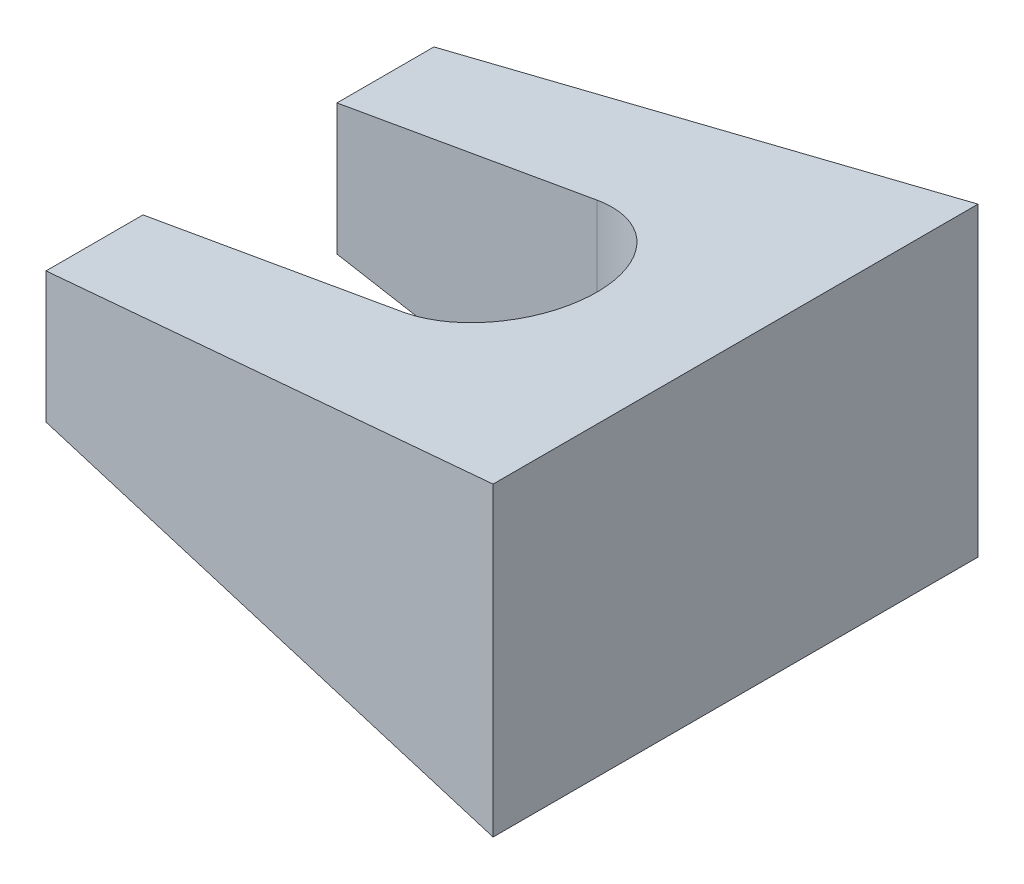
ISO-10303-21;
HEADER;
FILE_DESCRIPTION(('STEP AP214'),'2;1');
FILE_NAME('part.step','',(''),(''),'','','');
FILE_SCHEMA(('AUTOMOTIVE_DESIGN { 1 0 10303 214 1 1 1 1 }'));
ENDSEC;
DATA;
#1=APPLICATION_CONTEXT('core data for automotive mechanical design processes');
#2=APPLICATION_PROTOCOL_DEFINITION('international standard','automotive_design',2000,#1);
#3=PRODUCT_CONTEXT('',#1,'mechanical');
#4=PRODUCT('Part','Part','',(#3));
#5=PRODUCT_RELATED_PRODUCT_CATEGORY('part','',(#4));
#6=PRODUCT_DEFINITION_FORMATION('','',#4);
#7=PRODUCT_DEFINITION_CONTEXT('part definition',#1,'design');
#8=PRODUCT_DEFINITION('design','',#6,#7);
#9=PRODUCT_DEFINITION_SHAPE('','',#8);
#10=(LENGTH_UNIT() NAMED_UNIT(*) SI_UNIT(.MILLI.,.METRE.));
#11=(NAMED_UNIT(*) PLANE_ANGLE_UNIT() SI_UNIT($,.RADIAN.));
#12=(NAMED_UNIT(*) SI_UNIT($,.STERADIAN.) SOLID_ANGLE_UNIT());
#13=UNCERTAINTY_MEASURE_WITH_UNIT(LENGTH_MEASURE(1.E-05),#10,'distance_accuracy_value','');
#14=(GEOMETRIC_REPRESENTATION_CONTEXT(3) GLOBAL_UNCERTAINTY_ASSIGNED_CONTEXT((#13)) GLOBAL_UNIT_ASSIGNED_CONTEXT((#10,
#11,#12)) REPRESENTATION_CONTEXT('',''));
#15=CARTESIAN_POINT('',(0.,0.,0.));
#16=DIRECTION('',(0.,0.,1.));
#17=DIRECTION('',(1.,0.,0.));
#18=AXIS2_PLACEMENT_3D('',#15,#16,#17);
#19=CARTESIAN_POINT('',(-12.7739862611481,25.,10.));
#20=DIRECTION('',(1.,0.,0.));
#21=DIRECTION('',(0.,0.,-1.));
#22=AXIS2_PLACEMENT_3D('',#19,#20,#21);
#23=PLANE('',#22);
#24=DIRECTION('',(0.,0.,1.));
#25=VECTOR('',#24,1.);
#26=CARTESIAN_POINT('',(-12.7739862611481,-3.37531742098281,-12.5));
#27=LINE('',#26,#25);
#28=CARTESIAN_POINT('',(-12.7739862611481,-3.37531742098281,-10.));
#29=VERTEX_POINT('',#28);
#30=CARTESIAN_POINT('',(-12.7739862611481,-3.37531742098281,-5.));
#31=VERTEX_POINT('',#30);
#32=EDGE_CURVE('E132',#29,#31,#27,.T.);
#33=ORIENTED_EDGE('',*,*,#32,.T.);
#34=DIRECTION('',(0.,1.,0.));
#35=VECTOR('',#34,1.);
#36=CARTESIAN_POINT('',(-12.7739862611481,25.,-5.));
#37=LINE('',#36,#35);
#38=CARTESIAN_POINT('',(-12.7739862611481,3.37531742098281,-5.));
#39=VERTEX_POINT('',#38);
#40=EDGE_CURVE('E109',#31,#39,#37,.T.);
#41=ORIENTED_EDGE('',*,*,#40,.T.);
#42=DIRECTION('',(0.,0.,1.));
#43=VECTOR('',#42,1.);
#44=CARTESIAN_POINT('',(-12.7739862611481,3.37531742098281,-12.5));
#45=LINE('',#44,#43);
#46=CARTESIAN_POINT('',(-12.7739862611481,3.37531742098281,-10.));
#47=VERTEX_POINT('',#46);
#48=EDGE_CURVE('E135',#47,#39,#45,.T.);
#49=ORIENTED_EDGE('',*,*,#48,.F.);
#50=DIRECTION('',(0.,-1.,0.));
#51=VECTOR('',#50,1.);
#52=CARTESIAN_POINT('',(-12.7739862611481,25.,-10.));
#53=LINE('',#52,#51);
#54=EDGE_CURVE('E153',#47,#29,#53,.T.);
#55=ORIENTED_EDGE('',*,*,#54,.T.);
#56=EDGE_LOOP('',(#33,#41,#49,#55));
#57=FACE_BOUND('',#56,.T.);
#58=ADVANCED_FACE('F34',(#57),#23,.F.);
#59=CARTESIAN_POINT('',(-12.7739862611481,25.,-10.));
#60=DIRECTION('',(0.0973899493572263,0.,0.995246300050493));
#61=DIRECTION('',(0.995246300050494,0.,-0.0973899493572263));
#62=AXIS2_PLACEMENT_3D('',#59,#60,#61);
#63=PLANE('',#62);
#64=DIRECTION('',(-0.980266461448433,-0.172847425436974,0.0959240954045313));
#65=VECTOR('',#64,1.);
#66=CARTESIAN_POINT('',(-9.10997499386947,4.02138146502385,-10.3585422741551));
#67=LINE('',#66,#65);
#68=CARTESIAN_POINT('',(12.7739862611481,7.88011427906214,-12.5));
#69=VERTEX_POINT('',#68);
#70=EDGE_CURVE('E142',#69,#47,#67,.T.);
#71=ORIENTED_EDGE('',*,*,#70,.F.);
#72=DIRECTION('',(0.,-1.,0.));
#73=VECTOR('',#72,1.);
#74=CARTESIAN_POINT('',(12.7739862611481,25.,-12.5));
#75=LINE('',#74,#73);
#76=CARTESIAN_POINT('',(12.7739862611481,-7.88011427906214,-12.5));
#77=VERTEX_POINT('',#76);
#78=EDGE_CURVE('E144',#69,#77,#75,.T.);
#79=ORIENTED_EDGE('',*,*,#78,.T.);
#80=DIRECTION('',(0.980266461448433,-0.172847425436974,-0.0959240954045313));
#81=VECTOR('',#80,1.);
#82=CARTESIAN_POINT('',(-17.5818016990482,-2.52756984101433,-9.52953062775292));
#83=LINE('',#82,#81);
#84=EDGE_CURVE('E139',#29,#77,#83,.T.);
#85=ORIENTED_EDGE('',*,*,#84,.F.);
#86=ORIENTED_EDGE('',*,*,#54,.F.);
#87=EDGE_LOOP('',(#71,#79,#85,#86));
#88=FACE_BOUND('',#87,.T.);
#89=ADVANCED_FACE('F36',(#88),#63,.F.);
#90=CARTESIAN_POINT('',(-12.7739862611481,3.37531742098281,5.));
#91=VERTEX_POINT('',#90);
#92=CARTESIAN_POINT('',(-12.7739862611481,3.37531742098281,10.));
#93=VERTEX_POINT('',#92);
#94=EDGE_CURVE('E126',#91,#93,#45,.T.);
#95=ORIENTED_EDGE('',*,*,#94,.F.);
#96=DIRECTION('',(0.,-1.,0.));
#97=VECTOR('',#96,1.);
#98=CARTESIAN_POINT('',(-12.7739862611481,25.,5.));
#99=LINE('',#98,#97);
#100=CARTESIAN_POINT('',(-12.7739862611481,-3.37531742098281,5.));
#101=VERTEX_POINT('',#100);
#102=EDGE_CURVE('E49',#91,#101,#99,.T.);
#103=ORIENTED_EDGE('',*,*,#102,.T.);
#104=CARTESIAN_POINT('',(-12.7739862611481,-3.37531742098281,10.));
#105=VERTEX_POINT('',#104);
#106=EDGE_CURVE('E118',#101,#105,#27,.T.);
#107=ORIENTED_EDGE('',*,*,#106,.T.);
#108=DIRECTION('',(0.,-1.,0.));
#109=VECTOR('',#108,1.);
#110=CARTESIAN_POINT('',(-12.7739862611481,25.,10.));
#111=LINE('',#110,#109);
#112=EDGE_CURVE('E150',#93,#105,#111,.T.);
#113=ORIENTED_EDGE('',*,*,#112,.F.);
#114=EDGE_LOOP('',(#95,#103,#107,#113));
#115=FACE_BOUND('',#114,.T.);
#116=ADVANCED_FACE('F178',(#115),#23,.F.);
#117=CARTESIAN_POINT('',(-12.7739862611481,25.,10.));
#118=DIRECTION('',(0.0973899493572263,0.,-0.995246300050493));
#119=DIRECTION('',(-0.995246300050494,0.,-0.0973899493572263));
#120=AXIS2_PLACEMENT_3D('',#117,#118,#119);
#121=PLANE('',#120);
#122=DIRECTION('',(0.980266461448433,0.172847425436974,0.0959240954045313));
#123=VECTOR('',#122,1.);
#124=CARTESIAN_POINT('',(-9.10997499386947,4.02138146502385,10.3585422741551));
#125=LINE('',#124,#123);
#126=CARTESIAN_POINT('',(12.7739862611481,7.88011427906214,12.5));
#127=VERTEX_POINT('',#126);
#128=EDGE_CURVE('E57',#93,#127,#125,.T.);
#129=ORIENTED_EDGE('',*,*,#128,.F.);
#130=ORIENTED_EDGE('',*,*,#112,.T.);
#131=DIRECTION('',(-0.980266461448433,0.172847425436974,-0.0959240954045313));
#132=VECTOR('',#131,1.);
#133=CARTESIAN_POINT('',(-17.5818016990482,-2.52756984101433,9.52953062775292));
#134=LINE('',#133,#132);
#135=CARTESIAN_POINT('',(12.7739862611481,-7.88011427906214,12.5));
#136=VERTEX_POINT('',#135);
#137=EDGE_CURVE('E129',#136,#105,#134,.T.);
#138=ORIENTED_EDGE('',*,*,#137,.F.);
#139=DIRECTION('',(0.,-1.,0.));
#140=VECTOR('',#139,1.);
#141=CARTESIAN_POINT('',(12.7739862611481,25.,12.5));
#142=LINE('',#141,#140);
#143=EDGE_CURVE('E147',#127,#136,#142,.T.);
#144=ORIENTED_EDGE('',*,*,#143,.F.);
#145=EDGE_LOOP('',(#129,#130,#138,#144));
#146=FACE_BOUND('',#145,.T.);
#147=ADVANCED_FACE('F174',(#146),#121,.F.);
#148=CARTESIAN_POINT('',(12.7739862611481,25.,-12.5));
#149=DIRECTION('',(-1.,0.,0.));
#150=DIRECTION('',(0.,0.,1.));
#151=AXIS2_PLACEMENT_3D('',#148,#149,#150);
#152=PLANE('',#151);
#153=DIRECTION('',(0.,0.,1.));
#154=VECTOR('',#153,1.);
#155=CARTESIAN_POINT('',(12.7739862611481,7.88011427906214,-12.5));
#156=LINE('',#155,#154);
#157=EDGE_CURVE('E127',#69,#127,#156,.T.);
#158=ORIENTED_EDGE('',*,*,#157,.T.);
#159=ORIENTED_EDGE('',*,*,#143,.T.);
#160=DIRECTION('',(0.,0.,1.));
#161=VECTOR('',#160,1.);
#162=CARTESIAN_POINT('',(12.7739862611481,-7.88011427906214,-12.5));
#163=LINE('',#162,#161);
#164=EDGE_CURVE('E130',#77,#136,#163,.T.);
#165=ORIENTED_EDGE('',*,*,#164,.F.);
#166=ORIENTED_EDGE('',*,*,#78,.F.);
#167=EDGE_LOOP('',(#158,#159,#165,#166));
#168=FACE_BOUND('',#167,.T.);
#169=ADVANCED_FACE('F171',(#168),#152,.F.);
#170=CARTESIAN_POINT('',(-12.7739862611481,-3.37531742098281,-12.5));
#171=DIRECTION('',(-0.173648177666931,-0.984807753012208,0.));
#172=DIRECTION('',(0.984807753012208,-0.173648177666931,0.));
#173=AXIS2_PLACEMENT_3D('',#170,#171,#172);
#174=PLANE('',#173);
#175=DIRECTION('',(0.984807753012208,-0.173648177666931,0.));
#176=VECTOR('',#175,1.);
#177=CARTESIAN_POINT('',(-12.7739862611481,-3.37531742098281,-5.));
#178=LINE('',#177,#176);
#179=CARTESIAN_POINT('',(0.620317331084683,-5.73709453209377,-5.));
#180=VERTEX_POINT('',#179);
#181=EDGE_CURVE('E124',#31,#180,#178,.T.);
#182=ORIENTED_EDGE('',*,*,#181,.F.);
#183=ORIENTED_EDGE('',*,*,#32,.F.);
#184=ORIENTED_EDGE('',*,*,#84,.T.);
#185=ORIENTED_EDGE('',*,*,#164,.T.);
#186=ORIENTED_EDGE('',*,*,#137,.T.);
#187=ORIENTED_EDGE('',*,*,#106,.F.);
#188=DIRECTION('',(-0.984807753012208,0.173648177666931,0.));
#189=VECTOR('',#188,1.);
#190=CARTESIAN_POINT('',(-12.7739862611481,-3.37531742098281,5.));
#191=LINE('',#190,#189);
#192=CARTESIAN_POINT('',(0.620317331084683,-5.73709453209377,5.));
#193=VERTEX_POINT('',#192);
#194=EDGE_CURVE('E110',#193,#101,#191,.T.);
#195=ORIENTED_EDGE('',*,*,#194,.F.);
#196=CARTESIAN_POINT('',(0.620317331084683,-5.73709453209377,0.));
#197=DIRECTION('',(-0.173648177666931,-0.984807753012208,0.));
#198=DIRECTION('',(-0.984807753012208,0.173648177666931,0.));
#199=AXIS2_PLACEMENT_3D('',#196,#197,#198);
#200=ELLIPSE('',#199,5.07713305942873,5.);
#201=EDGE_CURVE('E99',#180,#193,#200,.T.);
#202=ORIENTED_EDGE('',*,*,#201,.F.);
#203=EDGE_LOOP('',(#182,#183,#184,#185,#186,#187,#195,#202));
#204=FACE_BOUND('',#203,.T.);
#205=ADVANCED_FACE('F116',(#204),#174,.T.);
#206=CARTESIAN_POINT('',(-12.7739862611481,3.37531742098281,-12.5));
#207=DIRECTION('',(-0.173648177666931,0.984807753012208,0.));
#208=DIRECTION('',(-0.984807753012208,-0.173648177666931,0.));
#209=AXIS2_PLACEMENT_3D('',#206,#207,#208);
#210=PLANE('',#209);
#211=DIRECTION('',(-0.984807753012208,-0.173648177666931,0.));
#212=VECTOR('',#211,1.);
#213=CARTESIAN_POINT('',(-12.7739862611481,3.37531742098281,-5.));
#214=LINE('',#213,#212);
#215=CARTESIAN_POINT('',(0.620317331084683,5.73709453209377,-5.));
#216=VERTEX_POINT('',#215);
#217=EDGE_CURVE('E12',#216,#39,#214,.T.);
#218=ORIENTED_EDGE('',*,*,#217,.F.);
#219=CARTESIAN_POINT('',(0.620317331084683,5.73709453209377,0.));
#220=DIRECTION('',(-0.173648177666931,0.984807753012208,0.));
#221=DIRECTION('',(0.984807753012208,0.173648177666931,0.));
#222=AXIS2_PLACEMENT_3D('',#219,#220,#221);
#223=ELLIPSE('',#222,5.07713305942873,5.);
#224=CARTESIAN_POINT('',(0.620317331084683,5.73709453209377,5.));
#225=VERTEX_POINT('',#224);
#226=EDGE_CURVE('E42',#225,#216,#223,.T.);
#227=ORIENTED_EDGE('',*,*,#226,.F.);
#228=DIRECTION('',(0.984807753012208,0.173648177666931,0.));
#229=VECTOR('',#228,1.);
#230=CARTESIAN_POINT('',(-12.7739862611481,3.37531742098281,5.));
#231=LINE('',#230,#229);
#232=EDGE_CURVE('E113',#91,#225,#231,.T.);
#233=ORIENTED_EDGE('',*,*,#232,.F.);
#234=ORIENTED_EDGE('',*,*,#94,.T.);
#235=ORIENTED_EDGE('',*,*,#128,.T.);
#236=ORIENTED_EDGE('',*,*,#157,.F.);
#237=ORIENTED_EDGE('',*,*,#70,.T.);
#238=ORIENTED_EDGE('',*,*,#48,.T.);
#239=EDGE_LOOP('',(#218,#227,#233,#234,#235,#236,#237,#238));
#240=FACE_BOUND('',#239,.T.);
#241=ADVANCED_FACE('F160',(#240),#210,.T.);
#242=CARTESIAN_POINT('',(-17.8168922317101,-7.88011427906214,-5.));
#243=DIRECTION('',(0.,0.,-1.));
#244=DIRECTION('',(-1.,0.,0.));
#245=AXIS2_PLACEMENT_3D('',#242,#243,#244);
#246=PLANE('',#245);
#247=ORIENTED_EDGE('',*,*,#181,.T.);
#248=DIRECTION('',(0.,1.,0.));
#249=VECTOR('',#248,1.);
#250=CARTESIAN_POINT('',(0.620317331084683,-7.88011427906214,-5.));
#251=LINE('',#250,#249);
#252=EDGE_CURVE('E105',#180,#216,#251,.T.);
#253=ORIENTED_EDGE('',*,*,#252,.T.);
#254=ORIENTED_EDGE('',*,*,#217,.T.);
#255=ORIENTED_EDGE('',*,*,#40,.F.);
#256=EDGE_LOOP('',(#247,#253,#254,#255));
#257=FACE_BOUND('',#256,.T.);
#258=ADVANCED_FACE('F158',(#257),#246,.F.);
#259=CARTESIAN_POINT('',(0.620317331084683,-7.88011427906214,0.));
#260=DIRECTION('',(0.,1.,0.));
#261=DIRECTION('',(0.,0.,1.));
#262=AXIS2_PLACEMENT_3D('',#259,#260,#261);
#263=CYLINDRICAL_SURFACE('',#262,5.);
#264=ORIENTED_EDGE('',*,*,#201,.T.);
#265=DIRECTION('',(0.,1.,0.));
#266=VECTOR('',#265,1.);
#267=CARTESIAN_POINT('',(0.620317331084683,-7.88011427906214,5.));
#268=LINE('',#267,#266);
#269=EDGE_CURVE('E102',#193,#225,#268,.T.);
#270=ORIENTED_EDGE('',*,*,#269,.T.);
#271=ORIENTED_EDGE('',*,*,#226,.T.);
#272=ORIENTED_EDGE('',*,*,#252,.F.);
#273=EDGE_LOOP('',(#264,#270,#271,#272));
#274=FACE_BOUND('',#273,.T.);
#275=ADVANCED_FACE('F101',(#274),#263,.F.);
#276=CARTESIAN_POINT('',(-17.8168922317101,-7.88011427906214,5.));
#277=DIRECTION('',(0.,0.,1.));
#278=DIRECTION('',(1.,0.,0.));
#279=AXIS2_PLACEMENT_3D('',#276,#277,#278);
#280=PLANE('',#279);
#281=ORIENTED_EDGE('',*,*,#194,.T.);
#282=ORIENTED_EDGE('',*,*,#102,.F.);
#283=ORIENTED_EDGE('',*,*,#232,.T.);
#284=ORIENTED_EDGE('',*,*,#269,.F.);
#285=EDGE_LOOP('',(#281,#282,#283,#284));
#286=FACE_BOUND('',#285,.T.);
#287=ADVANCED_FACE('F112',(#286),#280,.F.);
#288=CLOSED_SHELL('',(#58,#89,#116,#147,#169,#205,#241,#258,#275,#287));
#289=MANIFOLD_SOLID_BREP('B2',#288);
#290=ADVANCED_BREP_SHAPE_REPRESENTATION('',(#18,#289),#14);
#291=SHAPE_DEFINITION_REPRESENTATION(#9,#290);
ENDSEC;
END-ISO-10303-21;
